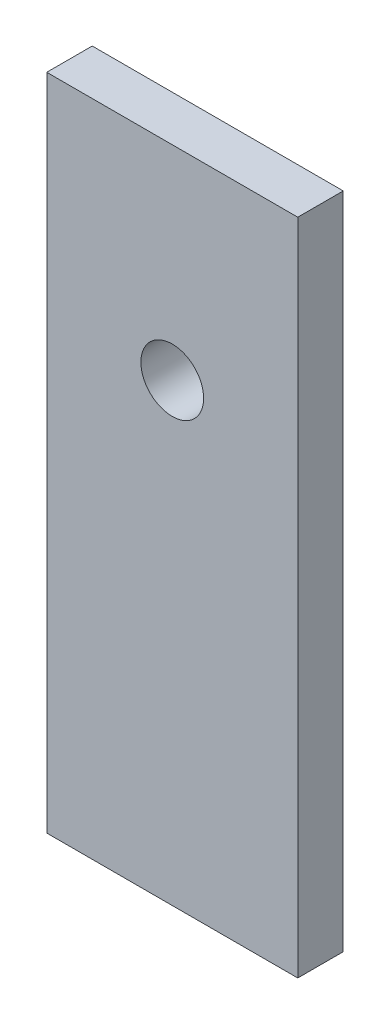
ISO-10303-21;
HEADER;
FILE_DESCRIPTION(('STEP AP214'),'2;1');
FILE_NAME('part.step','',(''),(''),'','','');
FILE_SCHEMA(('AUTOMOTIVE_DESIGN { 1 0 10303 214 1 1 1 1 }'));
ENDSEC;
DATA;
#1=APPLICATION_CONTEXT('core data for automotive mechanical design processes');
#2=APPLICATION_PROTOCOL_DEFINITION('international standard','automotive_design',2000,#1);
#3=PRODUCT_CONTEXT('',#1,'mechanical');
#4=PRODUCT('Part','Part','',(#3));
#5=PRODUCT_RELATED_PRODUCT_CATEGORY('part','',(#4));
#6=PRODUCT_DEFINITION_FORMATION('','',#4);
#7=PRODUCT_DEFINITION_CONTEXT('part definition',#1,'design');
#8=PRODUCT_DEFINITION('design','',#6,#7);
#9=PRODUCT_DEFINITION_SHAPE('','',#8);
#10=(LENGTH_UNIT() NAMED_UNIT(*) SI_UNIT(.MILLI.,.METRE.));
#11=(NAMED_UNIT(*) PLANE_ANGLE_UNIT() SI_UNIT($,.RADIAN.));
#12=(NAMED_UNIT(*) SI_UNIT($,.STERADIAN.) SOLID_ANGLE_UNIT());
#13=UNCERTAINTY_MEASURE_WITH_UNIT(LENGTH_MEASURE(1.E-05),#10,'distance_accuracy_value','');
#14=(GEOMETRIC_REPRESENTATION_CONTEXT(3) GLOBAL_UNCERTAINTY_ASSIGNED_CONTEXT((#13)) GLOBAL_UNIT_ASSIGNED_CONTEXT((#10,
#11,#12)) REPRESENTATION_CONTEXT('',''));
#15=CARTESIAN_POINT('',(0.,0.,0.));
#16=DIRECTION('',(0.,0.,1.));
#17=DIRECTION('',(1.,0.,0.));
#18=AXIS2_PLACEMENT_3D('',#15,#16,#17);
#19=CARTESIAN_POINT('',(0.,0.,5.8));
#20=DIRECTION('',(0.,0.,-1.));
#21=DIRECTION('',(-1.,0.,0.));
#22=AXIS2_PLACEMENT_3D('',#19,#20,#21);
#23=PLANE('',#22);
#24=DIRECTION('',(0.,-1.,0.));
#25=VECTOR('',#24,1.);
#26=CARTESIAN_POINT('',(0.,0.,5.8));
#27=LINE('',#26,#25);
#28=CARTESIAN_POINT('',(0.,84.,5.8));
#29=VERTEX_POINT('',#28);
#30=CARTESIAN_POINT('',(0.,0.,5.8));
#31=VERTEX_POINT('',#30);
#32=EDGE_CURVE('E87',#29,#31,#27,.T.);
#33=ORIENTED_EDGE('',*,*,#32,.T.);
#34=DIRECTION('',(1.,0.,0.));
#35=VECTOR('',#34,1.);
#36=CARTESIAN_POINT('',(0.,0.,5.8));
#37=LINE('',#36,#35);
#38=CARTESIAN_POINT('',(32.,0.,5.8));
#39=VERTEX_POINT('',#38);
#40=EDGE_CURVE('E82',#31,#39,#37,.T.);
#41=ORIENTED_EDGE('',*,*,#40,.T.);
#42=DIRECTION('',(0.,1.,0.));
#43=VECTOR('',#42,1.);
#44=CARTESIAN_POINT('',(32.,0.,5.8));
#45=LINE('',#44,#43);
#46=CARTESIAN_POINT('',(32.,84.,5.8));
#47=VERTEX_POINT('',#46);
#48=EDGE_CURVE('E85',#39,#47,#45,.T.);
#49=ORIENTED_EDGE('',*,*,#48,.T.);
#50=DIRECTION('',(-1.,0.,0.));
#51=VECTOR('',#50,1.);
#52=CARTESIAN_POINT('',(0.,84.,5.8));
#53=LINE('',#52,#51);
#54=EDGE_CURVE('E52',#47,#29,#53,.T.);
#55=ORIENTED_EDGE('',*,*,#54,.T.);
#56=EDGE_LOOP('',(#33,#41,#49,#55));
#57=FACE_BOUND('',#56,.T.);
#58=CARTESIAN_POINT('',(16.,58.,5.8));
#59=DIRECTION('',(0.,0.,1.));
#60=DIRECTION('',(1.,0.,0.));
#61=AXIS2_PLACEMENT_3D('',#58,#59,#60);
#62=CIRCLE('',#61,3.99999999999999);
#63=CARTESIAN_POINT('',(20.,58.,5.8));
#64=VERTEX_POINT('',#63);
#65=EDGE_CURVE('E102',#64,#64,#62,.T.);
#66=ORIENTED_EDGE('',*,*,#65,.F.);
#67=EDGE_LOOP('',(#66));
#68=FACE_BOUND('',#67,.T.);
#69=ADVANCED_FACE('F35',(#57,#68),#23,.F.);
#70=CARTESIAN_POINT('',(0.,0.,0.));
#71=DIRECTION('',(0.,0.,-1.));
#72=DIRECTION('',(-1.,0.,0.));
#73=AXIS2_PLACEMENT_3D('',#70,#71,#72);
#74=PLANE('',#73);
#75=DIRECTION('',(0.,-1.,0.));
#76=VECTOR('',#75,1.);
#77=CARTESIAN_POINT('',(0.,0.,0.));
#78=LINE('',#77,#76);
#79=CARTESIAN_POINT('',(0.,84.,0.));
#80=VERTEX_POINT('',#79);
#81=CARTESIAN_POINT('',(0.,0.,0.));
#82=VERTEX_POINT('',#81);
#83=EDGE_CURVE('E99',#80,#82,#78,.T.);
#84=ORIENTED_EDGE('',*,*,#83,.F.);
#85=DIRECTION('',(-1.,0.,0.));
#86=VECTOR('',#85,1.);
#87=CARTESIAN_POINT('',(0.,84.,0.));
#88=LINE('',#87,#86);
#89=CARTESIAN_POINT('',(32.,84.,0.));
#90=VERTEX_POINT('',#89);
#91=EDGE_CURVE('E75',#90,#80,#88,.T.);
#92=ORIENTED_EDGE('',*,*,#91,.F.);
#93=DIRECTION('',(0.,1.,0.));
#94=VECTOR('',#93,1.);
#95=CARTESIAN_POINT('',(32.,0.,0.));
#96=LINE('',#95,#94);
#97=CARTESIAN_POINT('',(32.,0.,0.));
#98=VERTEX_POINT('',#97);
#99=EDGE_CURVE('E69',#98,#90,#96,.T.);
#100=ORIENTED_EDGE('',*,*,#99,.F.);
#101=DIRECTION('',(1.,0.,0.));
#102=VECTOR('',#101,1.);
#103=CARTESIAN_POINT('',(0.,0.,0.));
#104=LINE('',#103,#102);
#105=EDGE_CURVE('E91',#82,#98,#104,.T.);
#106=ORIENTED_EDGE('',*,*,#105,.F.);
#107=EDGE_LOOP('',(#84,#92,#100,#106));
#108=FACE_BOUND('',#107,.T.);
#109=CARTESIAN_POINT('',(16.,58.,0.));
#110=DIRECTION('',(0.,0.,1.));
#111=DIRECTION('',(1.,0.,0.));
#112=AXIS2_PLACEMENT_3D('',#109,#110,#111);
#113=CIRCLE('',#112,3.99999999999999);
#114=CARTESIAN_POINT('',(20.,58.,0.));
#115=VERTEX_POINT('',#114);
#116=EDGE_CURVE('E114',#115,#115,#113,.T.);
#117=ORIENTED_EDGE('',*,*,#116,.T.);
#118=EDGE_LOOP('',(#117));
#119=FACE_BOUND('',#118,.T.);
#120=ADVANCED_FACE('F110',(#108,#119),#74,.T.);
#121=CARTESIAN_POINT('',(0.,0.,5.8));
#122=DIRECTION('',(1.,0.,0.));
#123=DIRECTION('',(0.,0.,-1.));
#124=AXIS2_PLACEMENT_3D('',#121,#122,#123);
#125=PLANE('',#124);
#126=ORIENTED_EDGE('',*,*,#83,.T.);
#127=DIRECTION('',(0.,0.,-1.));
#128=VECTOR('',#127,1.);
#129=CARTESIAN_POINT('',(0.,0.,5.8));
#130=LINE('',#129,#128);
#131=EDGE_CURVE('E11',#31,#82,#130,.T.);
#132=ORIENTED_EDGE('',*,*,#131,.F.);
#133=ORIENTED_EDGE('',*,*,#32,.F.);
#134=DIRECTION('',(0.,0.,-1.));
#135=VECTOR('',#134,1.);
#136=CARTESIAN_POINT('',(0.,84.,5.8));
#137=LINE('',#136,#135);
#138=EDGE_CURVE('E95',#29,#80,#137,.T.);
#139=ORIENTED_EDGE('',*,*,#138,.T.);
#140=EDGE_LOOP('',(#126,#132,#133,#139));
#141=FACE_BOUND('',#140,.T.);
#142=ADVANCED_FACE('F37',(#141),#125,.F.);
#143=CARTESIAN_POINT('',(0.,0.,5.8));
#144=DIRECTION('',(0.,1.,0.));
#145=DIRECTION('',(0.,0.,1.));
#146=AXIS2_PLACEMENT_3D('',#143,#144,#145);
#147=PLANE('',#146);
#148=ORIENTED_EDGE('',*,*,#105,.T.);
#149=DIRECTION('',(0.,0.,-1.));
#150=VECTOR('',#149,1.);
#151=CARTESIAN_POINT('',(32.,0.,5.8));
#152=LINE('',#151,#150);
#153=EDGE_CURVE('E44',#39,#98,#152,.T.);
#154=ORIENTED_EDGE('',*,*,#153,.F.);
#155=ORIENTED_EDGE('',*,*,#40,.F.);
#156=ORIENTED_EDGE('',*,*,#131,.T.);
#157=EDGE_LOOP('',(#148,#154,#155,#156));
#158=FACE_BOUND('',#157,.T.);
#159=ADVANCED_FACE('F90',(#158),#147,.F.);
#160=CARTESIAN_POINT('',(32.,0.,5.8));
#161=DIRECTION('',(-1.,0.,0.));
#162=DIRECTION('',(0.,0.,1.));
#163=AXIS2_PLACEMENT_3D('',#160,#161,#162);
#164=PLANE('',#163);
#165=ORIENTED_EDGE('',*,*,#99,.T.);
#166=DIRECTION('',(0.,0.,-1.));
#167=VECTOR('',#166,1.);
#168=CARTESIAN_POINT('',(32.,84.,5.8));
#169=LINE('',#168,#167);
#170=EDGE_CURVE('E92',#47,#90,#169,.T.);
#171=ORIENTED_EDGE('',*,*,#170,.F.);
#172=ORIENTED_EDGE('',*,*,#48,.F.);
#173=ORIENTED_EDGE('',*,*,#153,.T.);
#174=EDGE_LOOP('',(#165,#171,#172,#173));
#175=FACE_BOUND('',#174,.T.);
#176=ADVANCED_FACE('F93',(#175),#164,.F.);
#177=CARTESIAN_POINT('',(0.,84.,5.8));
#178=DIRECTION('',(0.,-1.,0.));
#179=DIRECTION('',(0.,0.,-1.));
#180=AXIS2_PLACEMENT_3D('',#177,#178,#179);
#181=PLANE('',#180);
#182=ORIENTED_EDGE('',*,*,#91,.T.);
#183=ORIENTED_EDGE('',*,*,#138,.F.);
#184=ORIENTED_EDGE('',*,*,#54,.F.);
#185=ORIENTED_EDGE('',*,*,#170,.T.);
#186=EDGE_LOOP('',(#182,#183,#184,#185));
#187=FACE_BOUND('',#186,.T.);
#188=ADVANCED_FACE('F107',(#187),#181,.F.);
#189=CARTESIAN_POINT('',(16.,58.,5.8));
#190=DIRECTION('',(0.,0.,-1.));
#191=DIRECTION('',(-1.,0.,0.));
#192=AXIS2_PLACEMENT_3D('',#189,#190,#191);
#193=CYLINDRICAL_SURFACE('',#192,3.99999999999999);
#194=ORIENTED_EDGE('',*,*,#65,.T.);
#195=EDGE_LOOP('',(#194));
#196=FACE_BOUND('',#195,.T.);
#197=ORIENTED_EDGE('',*,*,#116,.F.);
#198=EDGE_LOOP('',(#197));
#199=FACE_BOUND('',#198,.T.);
#200=ADVANCED_FACE('F120',(#196,#199),#193,.F.);
#201=CLOSED_SHELL('',(#69,#120,#142,#159,#176,#188,#200));
#202=MANIFOLD_SOLID_BREP('B2',#201);
#203=ADVANCED_BREP_SHAPE_REPRESENTATION('',(#18,#202),#14);
#204=SHAPE_DEFINITION_REPRESENTATION(#9,#203);
ENDSEC;
END-ISO-10303-21;
